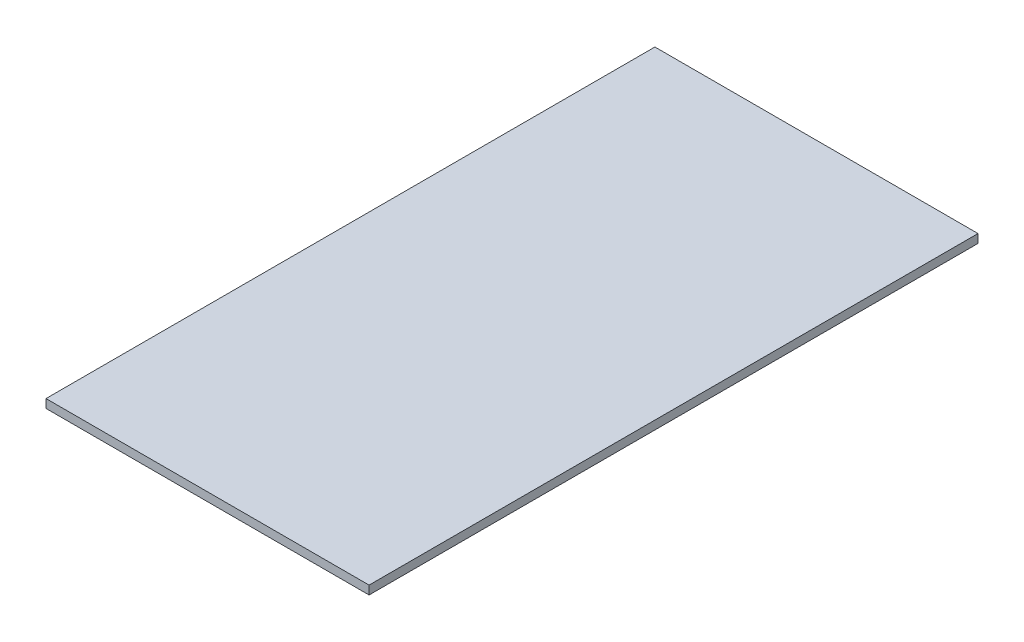
ISO-10303-21;
HEADER;
FILE_DESCRIPTION(('STEP AP214'),'2;1');
FILE_NAME('part.step','',(''),(''),'','','');
FILE_SCHEMA(('AUTOMOTIVE_DESIGN { 1 0 10303 214 1 1 1 1 }'));
ENDSEC;
DATA;
#1=APPLICATION_CONTEXT('core data for automotive mechanical design processes');
#2=APPLICATION_PROTOCOL_DEFINITION('international standard','automotive_design',2000,#1);
#3=PRODUCT_CONTEXT('',#1,'mechanical');
#4=PRODUCT('Part','Part','',(#3));
#5=PRODUCT_RELATED_PRODUCT_CATEGORY('part','',(#4));
#6=PRODUCT_DEFINITION_FORMATION('','',#4);
#7=PRODUCT_DEFINITION_CONTEXT('part definition',#1,'design');
#8=PRODUCT_DEFINITION('design','',#6,#7);
#9=PRODUCT_DEFINITION_SHAPE('','',#8);
#10=(LENGTH_UNIT() NAMED_UNIT(*) SI_UNIT(.MILLI.,.METRE.));
#11=(NAMED_UNIT(*) PLANE_ANGLE_UNIT() SI_UNIT($,.RADIAN.));
#12=(NAMED_UNIT(*) SI_UNIT($,.STERADIAN.) SOLID_ANGLE_UNIT());
#13=UNCERTAINTY_MEASURE_WITH_UNIT(LENGTH_MEASURE(1.E-05),#10,'distance_accuracy_value','');
#14=(GEOMETRIC_REPRESENTATION_CONTEXT(3) GLOBAL_UNCERTAINTY_ASSIGNED_CONTEXT((#13)) GLOBAL_UNIT_ASSIGNED_CONTEXT((#10,
#11,#12)) REPRESENTATION_CONTEXT('',''));
#15=CARTESIAN_POINT('',(0.,0.,0.));
#16=DIRECTION('',(0.,0.,1.));
#17=DIRECTION('',(1.,0.,0.));
#18=AXIS2_PLACEMENT_3D('',#15,#16,#17);
#19=CARTESIAN_POINT('',(112.75,6.,212.5));
#20=DIRECTION('',(-1.,0.,0.));
#21=DIRECTION('',(0.,0.,1.));
#22=AXIS2_PLACEMENT_3D('',#19,#20,#21);
#23=PLANE('',#22);
#24=DIRECTION('',(0.,0.,-1.));
#25=VECTOR('',#24,1.);
#26=CARTESIAN_POINT('',(112.75,0.,212.5));
#27=LINE('',#26,#25);
#28=CARTESIAN_POINT('',(112.75,0.,212.5));
#29=VERTEX_POINT('',#28);
#30=CARTESIAN_POINT('',(112.75,0.,-212.5));
#31=VERTEX_POINT('',#30);
#32=EDGE_CURVE('E96',#29,#31,#27,.T.);
#33=ORIENTED_EDGE('',*,*,#32,.T.);
#34=DIRECTION('',(0.,-1.,0.));
#35=VECTOR('',#34,1.);
#36=CARTESIAN_POINT('',(112.75,6.,-212.5));
#37=LINE('',#36,#35);
#38=CARTESIAN_POINT('',(112.75,6.,-212.5));
#39=VERTEX_POINT('',#38);
#40=EDGE_CURVE('E11',#39,#31,#37,.T.);
#41=ORIENTED_EDGE('',*,*,#40,.F.);
#42=DIRECTION('',(0.,0.,-1.));
#43=VECTOR('',#42,1.);
#44=CARTESIAN_POINT('',(112.75,6.,212.5));
#45=LINE('',#44,#43);
#46=CARTESIAN_POINT('',(112.75,6.,212.5));
#47=VERTEX_POINT('',#46);
#48=EDGE_CURVE('E84',#47,#39,#45,.T.);
#49=ORIENTED_EDGE('',*,*,#48,.F.);
#50=DIRECTION('',(0.,-1.,0.));
#51=VECTOR('',#50,1.);
#52=CARTESIAN_POINT('',(112.75,6.,212.5));
#53=LINE('',#52,#51);
#54=EDGE_CURVE('E92',#47,#29,#53,.T.);
#55=ORIENTED_EDGE('',*,*,#54,.T.);
#56=EDGE_LOOP('',(#33,#41,#49,#55));
#57=FACE_BOUND('',#56,.T.);
#58=ADVANCED_FACE('F33',(#57),#23,.F.);
#59=CARTESIAN_POINT('',(-112.75,6.,-212.5));
#60=DIRECTION('',(0.,0.,1.));
#61=DIRECTION('',(1.,0.,0.));
#62=AXIS2_PLACEMENT_3D('',#59,#60,#61);
#63=PLANE('',#62);
#64=DIRECTION('',(-1.,0.,0.));
#65=VECTOR('',#64,1.);
#66=CARTESIAN_POINT('',(-112.75,0.,-212.5));
#67=LINE('',#66,#65);
#68=CARTESIAN_POINT('',(-112.75,0.,-212.5));
#69=VERTEX_POINT('',#68);
#70=EDGE_CURVE('E88',#31,#69,#67,.T.);
#71=ORIENTED_EDGE('',*,*,#70,.T.);
#72=DIRECTION('',(0.,-1.,0.));
#73=VECTOR('',#72,1.);
#74=CARTESIAN_POINT('',(-112.75,6.,-212.5));
#75=LINE('',#74,#73);
#76=CARTESIAN_POINT('',(-112.75,6.,-212.5));
#77=VERTEX_POINT('',#76);
#78=EDGE_CURVE('E41',#77,#69,#75,.T.);
#79=ORIENTED_EDGE('',*,*,#78,.F.);
#80=DIRECTION('',(-1.,0.,0.));
#81=VECTOR('',#80,1.);
#82=CARTESIAN_POINT('',(-112.75,6.,-212.5));
#83=LINE('',#82,#81);
#84=EDGE_CURVE('E79',#39,#77,#83,.T.);
#85=ORIENTED_EDGE('',*,*,#84,.F.);
#86=ORIENTED_EDGE('',*,*,#40,.T.);
#87=EDGE_LOOP('',(#71,#79,#85,#86));
#88=FACE_BOUND('',#87,.T.);
#89=ADVANCED_FACE('F87',(#88),#63,.F.);
#90=CARTESIAN_POINT('',(-112.75,6.,212.5));
#91=DIRECTION('',(1.,0.,0.));
#92=DIRECTION('',(0.,0.,-1.));
#93=AXIS2_PLACEMENT_3D('',#90,#91,#92);
#94=PLANE('',#93);
#95=DIRECTION('',(0.,0.,1.));
#96=VECTOR('',#95,1.);
#97=CARTESIAN_POINT('',(-112.75,0.,212.5));
#98=LINE('',#97,#96);
#99=CARTESIAN_POINT('',(-112.75,0.,212.5));
#100=VERTEX_POINT('',#99);
#101=EDGE_CURVE('E66',#69,#100,#98,.T.);
#102=ORIENTED_EDGE('',*,*,#101,.T.);
#103=DIRECTION('',(0.,-1.,0.));
#104=VECTOR('',#103,1.);
#105=CARTESIAN_POINT('',(-112.75,6.,212.5));
#106=LINE('',#105,#104);
#107=CARTESIAN_POINT('',(-112.75,6.,212.5));
#108=VERTEX_POINT('',#107);
#109=EDGE_CURVE('E89',#108,#100,#106,.T.);
#110=ORIENTED_EDGE('',*,*,#109,.F.);
#111=DIRECTION('',(0.,0.,1.));
#112=VECTOR('',#111,1.);
#113=CARTESIAN_POINT('',(-112.75,6.,212.5));
#114=LINE('',#113,#112);
#115=EDGE_CURVE('E82',#77,#108,#114,.T.);
#116=ORIENTED_EDGE('',*,*,#115,.F.);
#117=ORIENTED_EDGE('',*,*,#78,.T.);
#118=EDGE_LOOP('',(#102,#110,#116,#117));
#119=FACE_BOUND('',#118,.T.);
#120=ADVANCED_FACE('F90',(#119),#94,.F.);
#121=CARTESIAN_POINT('',(-112.75,6.,212.5));
#122=DIRECTION('',(0.,0.,-1.));
#123=DIRECTION('',(-1.,0.,0.));
#124=AXIS2_PLACEMENT_3D('',#121,#122,#123);
#125=PLANE('',#124);
#126=DIRECTION('',(1.,0.,0.));
#127=VECTOR('',#126,1.);
#128=CARTESIAN_POINT('',(-112.75,0.,212.5));
#129=LINE('',#128,#127);
#130=EDGE_CURVE('E72',#100,#29,#129,.T.);
#131=ORIENTED_EDGE('',*,*,#130,.T.);
#132=ORIENTED_EDGE('',*,*,#54,.F.);
#133=DIRECTION('',(1.,0.,0.));
#134=VECTOR('',#133,1.);
#135=CARTESIAN_POINT('',(-112.75,6.,212.5));
#136=LINE('',#135,#134);
#137=EDGE_CURVE('E49',#108,#47,#136,.T.);
#138=ORIENTED_EDGE('',*,*,#137,.F.);
#139=ORIENTED_EDGE('',*,*,#109,.T.);
#140=EDGE_LOOP('',(#131,#132,#138,#139));
#141=FACE_BOUND('',#140,.T.);
#142=ADVANCED_FACE('F103',(#141),#125,.F.);
#143=CARTESIAN_POINT('',(0.,6.,0.));
#144=DIRECTION('',(0.,-1.,0.));
#145=DIRECTION('',(0.,0.,-1.));
#146=AXIS2_PLACEMENT_3D('',#143,#144,#145);
#147=PLANE('',#146);
#148=ORIENTED_EDGE('',*,*,#48,.T.);
#149=ORIENTED_EDGE('',*,*,#84,.T.);
#150=ORIENTED_EDGE('',*,*,#115,.T.);
#151=ORIENTED_EDGE('',*,*,#137,.T.);
#152=EDGE_LOOP('',(#148,#149,#150,#151));
#153=FACE_BOUND('',#152,.T.);
#154=ADVANCED_FACE('F80',(#153),#147,.F.);
#155=CARTESIAN_POINT('',(0.,0.,0.));
#156=DIRECTION('',(0.,-1.,0.));
#157=DIRECTION('',(0.,0.,-1.));
#158=AXIS2_PLACEMENT_3D('',#155,#156,#157);
#159=PLANE('',#158);
#160=ORIENTED_EDGE('',*,*,#32,.F.);
#161=ORIENTED_EDGE('',*,*,#130,.F.);
#162=ORIENTED_EDGE('',*,*,#101,.F.);
#163=ORIENTED_EDGE('',*,*,#70,.F.);
#164=EDGE_LOOP('',(#160,#161,#162,#163));
#165=FACE_BOUND('',#164,.T.);
#166=ADVANCED_FACE('F106',(#165),#159,.T.);
#167=CLOSED_SHELL('',(#58,#89,#120,#142,#154,#166));
#168=MANIFOLD_SOLID_BREP('B2',#167);
#169=ADVANCED_BREP_SHAPE_REPRESENTATION('',(#18,#168),#14);
#170=SHAPE_DEFINITION_REPRESENTATION(#9,#169);
ENDSEC;
END-ISO-10303-21;
